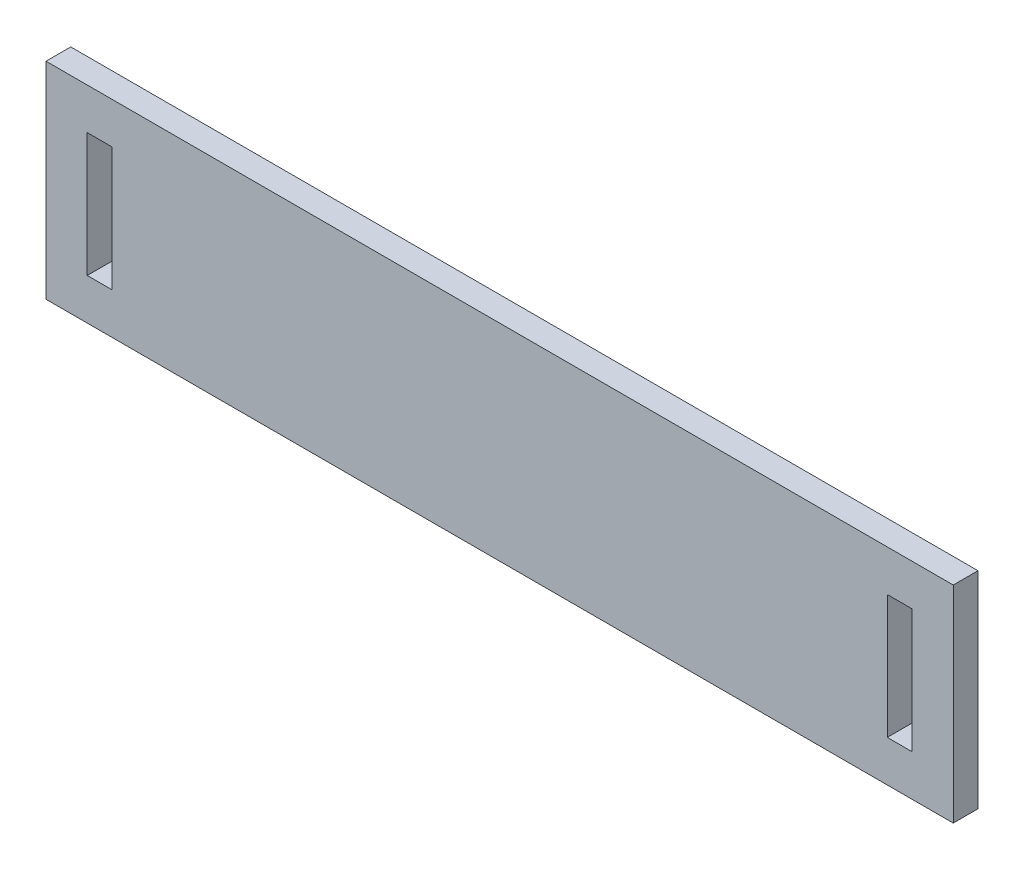
ISO-10303-21;
HEADER;
FILE_DESCRIPTION(('STEP AP214'),'2;1');
FILE_NAME('part.step','',(''),(''),'','','');
FILE_SCHEMA(('AUTOMOTIVE_DESIGN { 1 0 10303 214 1 1 1 1 }'));
ENDSEC;
DATA;
#1=APPLICATION_CONTEXT('core data for automotive mechanical design processes');
#2=APPLICATION_PROTOCOL_DEFINITION('international standard','automotive_design',2000,#1);
#3=PRODUCT_CONTEXT('',#1,'mechanical');
#4=PRODUCT('Part','Part','',(#3));
#5=PRODUCT_RELATED_PRODUCT_CATEGORY('part','',(#4));
#6=PRODUCT_DEFINITION_FORMATION('','',#4);
#7=PRODUCT_DEFINITION_CONTEXT('part definition',#1,'design');
#8=PRODUCT_DEFINITION('design','',#6,#7);
#9=PRODUCT_DEFINITION_SHAPE('','',#8);
#10=(LENGTH_UNIT() NAMED_UNIT(*) SI_UNIT(.MILLI.,.METRE.));
#11=(NAMED_UNIT(*) PLANE_ANGLE_UNIT() SI_UNIT($,.RADIAN.));
#12=(NAMED_UNIT(*) SI_UNIT($,.STERADIAN.) SOLID_ANGLE_UNIT());
#13=UNCERTAINTY_MEASURE_WITH_UNIT(LENGTH_MEASURE(1.E-05),#10,'distance_accuracy_value','');
#14=(GEOMETRIC_REPRESENTATION_CONTEXT(3) GLOBAL_UNCERTAINTY_ASSIGNED_CONTEXT((#13)) GLOBAL_UNIT_ASSIGNED_CONTEXT((#10,
#11,#12)) REPRESENTATION_CONTEXT('',''));
#15=CARTESIAN_POINT('',(0.,0.,0.));
#16=DIRECTION('',(0.,0.,1.));
#17=DIRECTION('',(1.,0.,0.));
#18=AXIS2_PLACEMENT_3D('',#15,#16,#17);
#19=CARTESIAN_POINT('',(55.,12.5,3.));
#20=DIRECTION('',(-1.,0.,0.));
#21=DIRECTION('',(0.,-1.,0.));
#22=AXIS2_PLACEMENT_3D('',#19,#20,#21);
#23=PLANE('',#22);
#24=DIRECTION('',(0.,1.,0.));
#25=VECTOR('',#24,1.);
#26=CARTESIAN_POINT('',(55.,12.5,0.));
#27=LINE('',#26,#25);
#28=CARTESIAN_POINT('',(55.,-12.5,0.));
#29=VERTEX_POINT('',#28);
#30=CARTESIAN_POINT('',(55.,12.5,0.));
#31=VERTEX_POINT('',#30);
#32=EDGE_CURVE('E161',#29,#31,#27,.T.);
#33=ORIENTED_EDGE('',*,*,#32,.T.);
#34=DIRECTION('',(0.,0.,-1.));
#35=VECTOR('',#34,1.);
#36=CARTESIAN_POINT('',(55.,12.5,3.));
#37=LINE('',#36,#35);
#38=CARTESIAN_POINT('',(55.,12.5,3.));
#39=VERTEX_POINT('',#38);
#40=EDGE_CURVE('E11',#39,#31,#37,.T.);
#41=ORIENTED_EDGE('',*,*,#40,.F.);
#42=DIRECTION('',(0.,1.,0.));
#43=VECTOR('',#42,1.);
#44=CARTESIAN_POINT('',(55.,12.5,3.));
#45=LINE('',#44,#43);
#46=CARTESIAN_POINT('',(55.,-12.5,3.));
#47=VERTEX_POINT('',#46);
#48=EDGE_CURVE('E194',#47,#39,#45,.T.);
#49=ORIENTED_EDGE('',*,*,#48,.F.);
#50=DIRECTION('',(0.,0.,-1.));
#51=VECTOR('',#50,1.);
#52=CARTESIAN_POINT('',(55.,-12.5,3.));
#53=LINE('',#52,#51);
#54=EDGE_CURVE('E204',#47,#29,#53,.T.);
#55=ORIENTED_EDGE('',*,*,#54,.T.);
#56=EDGE_LOOP('',(#33,#41,#49,#55));
#57=FACE_BOUND('',#56,.T.);
#58=ADVANCED_FACE('F35',(#57),#23,.F.);
#59=CARTESIAN_POINT('',(-55.,12.5,3.));
#60=DIRECTION('',(0.,-1.,0.));
#61=DIRECTION('',(0.,0.,-1.));
#62=AXIS2_PLACEMENT_3D('',#59,#60,#61);
#63=PLANE('',#62);
#64=DIRECTION('',(-1.,0.,0.));
#65=VECTOR('',#64,1.);
#66=CARTESIAN_POINT('',(-55.,12.5,0.));
#67=LINE('',#66,#65);
#68=CARTESIAN_POINT('',(-55.,12.5,0.));
#69=VERTEX_POINT('',#68);
#70=EDGE_CURVE('E207',#31,#69,#67,.T.);
#71=ORIENTED_EDGE('',*,*,#70,.T.);
#72=DIRECTION('',(0.,0.,-1.));
#73=VECTOR('',#72,1.);
#74=CARTESIAN_POINT('',(-55.,12.5,3.));
#75=LINE('',#74,#73);
#76=CARTESIAN_POINT('',(-55.,12.5,3.));
#77=VERTEX_POINT('',#76);
#78=EDGE_CURVE('E42',#77,#69,#75,.T.);
#79=ORIENTED_EDGE('',*,*,#78,.F.);
#80=DIRECTION('',(-1.,0.,0.));
#81=VECTOR('',#80,1.);
#82=CARTESIAN_POINT('',(-55.,12.5,3.));
#83=LINE('',#82,#81);
#84=EDGE_CURVE('E197',#39,#77,#83,.T.);
#85=ORIENTED_EDGE('',*,*,#84,.F.);
#86=ORIENTED_EDGE('',*,*,#40,.T.);
#87=EDGE_LOOP('',(#71,#79,#85,#86));
#88=FACE_BOUND('',#87,.T.);
#89=ADVANCED_FACE('F236',(#88),#63,.F.);
#90=CARTESIAN_POINT('',(-55.,12.5,3.));
#91=DIRECTION('',(1.,0.,0.));
#92=DIRECTION('',(0.,1.,0.));
#93=AXIS2_PLACEMENT_3D('',#90,#91,#92);
#94=PLANE('',#93);
#95=DIRECTION('',(0.,-1.,0.));
#96=VECTOR('',#95,1.);
#97=CARTESIAN_POINT('',(-55.,12.5,0.));
#98=LINE('',#97,#96);
#99=CARTESIAN_POINT('',(-55.,-12.5,0.));
#100=VERTEX_POINT('',#99);
#101=EDGE_CURVE('E209',#69,#100,#98,.T.);
#102=ORIENTED_EDGE('',*,*,#101,.T.);
#103=DIRECTION('',(0.,0.,-1.));
#104=VECTOR('',#103,1.);
#105=CARTESIAN_POINT('',(-55.,-12.5,3.));
#106=LINE('',#105,#104);
#107=CARTESIAN_POINT('',(-55.,-12.5,3.));
#108=VERTEX_POINT('',#107);
#109=EDGE_CURVE('E214',#108,#100,#106,.T.);
#110=ORIENTED_EDGE('',*,*,#109,.F.);
#111=DIRECTION('',(0.,-1.,0.));
#112=VECTOR('',#111,1.);
#113=CARTESIAN_POINT('',(-55.,12.5,3.));
#114=LINE('',#113,#112);
#115=EDGE_CURVE('E200',#77,#108,#114,.T.);
#116=ORIENTED_EDGE('',*,*,#115,.F.);
#117=ORIENTED_EDGE('',*,*,#78,.T.);
#118=EDGE_LOOP('',(#102,#110,#116,#117));
#119=FACE_BOUND('',#118,.T.);
#120=ADVANCED_FACE('F221',(#119),#94,.F.);
#121=CARTESIAN_POINT('',(-55.,-12.5,3.));
#122=DIRECTION('',(0.,1.,0.));
#123=DIRECTION('',(0.,0.,1.));
#124=AXIS2_PLACEMENT_3D('',#121,#122,#123);
#125=PLANE('',#124);
#126=DIRECTION('',(1.,0.,0.));
#127=VECTOR('',#126,1.);
#128=CARTESIAN_POINT('',(-55.,-12.5,0.));
#129=LINE('',#128,#127);
#130=EDGE_CURVE('E198',#100,#29,#129,.T.);
#131=ORIENTED_EDGE('',*,*,#130,.T.);
#132=ORIENTED_EDGE('',*,*,#54,.F.);
#133=DIRECTION('',(1.,0.,0.));
#134=VECTOR('',#133,1.);
#135=CARTESIAN_POINT('',(-55.,-12.5,3.));
#136=LINE('',#135,#134);
#137=EDGE_CURVE('E202',#108,#47,#136,.T.);
#138=ORIENTED_EDGE('',*,*,#137,.F.);
#139=ORIENTED_EDGE('',*,*,#109,.T.);
#140=EDGE_LOOP('',(#131,#132,#138,#139));
#141=FACE_BOUND('',#140,.T.);
#142=ADVANCED_FACE('F230',(#141),#125,.F.);
#143=CARTESIAN_POINT('',(0.,0.,3.));
#144=DIRECTION('',(0.,0.,1.));
#145=DIRECTION('',(1.,0.,0.));
#146=AXIS2_PLACEMENT_3D('',#143,#144,#145);
#147=PLANE('',#146);
#148=DIRECTION('',(0.,1.,0.));
#149=VECTOR('',#148,1.);
#150=CARTESIAN_POINT('',(47.,7.5,3.));
#151=LINE('',#150,#149);
#152=CARTESIAN_POINT('',(47.,-7.5,3.));
#153=VERTEX_POINT('',#152);
#154=CARTESIAN_POINT('',(47.,7.5,3.));
#155=VERTEX_POINT('',#154);
#156=EDGE_CURVE('E127',#153,#155,#151,.T.);
#157=ORIENTED_EDGE('',*,*,#156,.T.);
#158=DIRECTION('',(1.,0.,0.));
#159=VECTOR('',#158,1.);
#160=CARTESIAN_POINT('',(50.,7.5,3.));
#161=LINE('',#160,#159);
#162=CARTESIAN_POINT('',(50.,7.5,3.));
#163=VERTEX_POINT('',#162);
#164=EDGE_CURVE('E138',#155,#163,#161,.T.);
#165=ORIENTED_EDGE('',*,*,#164,.T.);
#166=DIRECTION('',(0.,-1.,0.));
#167=VECTOR('',#166,1.);
#168=CARTESIAN_POINT('',(50.,7.5,3.));
#169=LINE('',#168,#167);
#170=CARTESIAN_POINT('',(50.,-7.5,3.));
#171=VERTEX_POINT('',#170);
#172=EDGE_CURVE('E49',#163,#171,#169,.T.);
#173=ORIENTED_EDGE('',*,*,#172,.T.);
#174=DIRECTION('',(-1.,0.,0.));
#175=VECTOR('',#174,1.);
#176=CARTESIAN_POINT('',(50.,-7.5,3.));
#177=LINE('',#176,#175);
#178=EDGE_CURVE('E135',#171,#153,#177,.T.);
#179=ORIENTED_EDGE('',*,*,#178,.T.);
#180=EDGE_LOOP('',(#157,#165,#173,#179));
#181=FACE_BOUND('',#180,.T.);
#182=DIRECTION('',(0.,1.,0.));
#183=VECTOR('',#182,1.);
#184=CARTESIAN_POINT('',(-50.,7.50000000000001,3.));
#185=LINE('',#184,#183);
#186=CARTESIAN_POINT('',(-50.,-7.49999999999999,3.));
#187=VERTEX_POINT('',#186);
#188=CARTESIAN_POINT('',(-50.,7.50000000000001,3.));
#189=VERTEX_POINT('',#188);
#190=EDGE_CURVE('E165',#187,#189,#185,.T.);
#191=ORIENTED_EDGE('',*,*,#190,.T.);
#192=DIRECTION('',(1.,0.,0.));
#193=VECTOR('',#192,1.);
#194=CARTESIAN_POINT('',(-50.,7.50000000000001,3.));
#195=LINE('',#194,#193);
#196=CARTESIAN_POINT('',(-47.,7.50000000000001,3.));
#197=VERTEX_POINT('',#196);
#198=EDGE_CURVE('E168',#189,#197,#195,.T.);
#199=ORIENTED_EDGE('',*,*,#198,.T.);
#200=DIRECTION('',(0.,-1.,0.));
#201=VECTOR('',#200,1.);
#202=CARTESIAN_POINT('',(-47.,7.50000000000001,3.));
#203=LINE('',#202,#201);
#204=CARTESIAN_POINT('',(-47.,-7.49999999999999,3.));
#205=VERTEX_POINT('',#204);
#206=EDGE_CURVE('E57',#197,#205,#203,.T.);
#207=ORIENTED_EDGE('',*,*,#206,.T.);
#208=DIRECTION('',(-1.,0.,0.));
#209=VECTOR('',#208,1.);
#210=CARTESIAN_POINT('',(-50.,-7.49999999999999,3.));
#211=LINE('',#210,#209);
#212=EDGE_CURVE('E173',#205,#187,#211,.T.);
#213=ORIENTED_EDGE('',*,*,#212,.T.);
#214=EDGE_LOOP('',(#191,#199,#207,#213));
#215=FACE_BOUND('',#214,.T.);
#216=ORIENTED_EDGE('',*,*,#48,.T.);
#217=ORIENTED_EDGE('',*,*,#84,.T.);
#218=ORIENTED_EDGE('',*,*,#115,.T.);
#219=ORIENTED_EDGE('',*,*,#137,.T.);
#220=EDGE_LOOP('',(#216,#217,#218,#219));
#221=FACE_BOUND('',#220,.T.);
#222=ADVANCED_FACE('F142',(#181,#215,#221),#147,.T.);
#223=CARTESIAN_POINT('',(0.,0.,0.));
#224=DIRECTION('',(0.,0.,1.));
#225=DIRECTION('',(1.,0.,0.));
#226=AXIS2_PLACEMENT_3D('',#223,#224,#225);
#227=PLANE('',#226);
#228=DIRECTION('',(1.,0.,0.));
#229=VECTOR('',#228,1.);
#230=CARTESIAN_POINT('',(50.,7.5,0.));
#231=LINE('',#230,#229);
#232=CARTESIAN_POINT('',(47.,7.5,0.));
#233=VERTEX_POINT('',#232);
#234=CARTESIAN_POINT('',(50.,7.5,0.));
#235=VERTEX_POINT('',#234);
#236=EDGE_CURVE('E154',#233,#235,#231,.T.);
#237=ORIENTED_EDGE('',*,*,#236,.F.);
#238=DIRECTION('',(0.,1.,0.));
#239=VECTOR('',#238,1.);
#240=CARTESIAN_POINT('',(47.,7.5,0.));
#241=LINE('',#240,#239);
#242=CARTESIAN_POINT('',(47.,-7.5,0.));
#243=VERTEX_POINT('',#242);
#244=EDGE_CURVE('E130',#243,#233,#241,.T.);
#245=ORIENTED_EDGE('',*,*,#244,.F.);
#246=DIRECTION('',(-1.,0.,0.));
#247=VECTOR('',#246,1.);
#248=CARTESIAN_POINT('',(50.,-7.5,0.));
#249=LINE('',#248,#247);
#250=CARTESIAN_POINT('',(50.,-7.5,0.));
#251=VERTEX_POINT('',#250);
#252=EDGE_CURVE('E145',#251,#243,#249,.T.);
#253=ORIENTED_EDGE('',*,*,#252,.F.);
#254=DIRECTION('',(0.,-1.,0.));
#255=VECTOR('',#254,1.);
#256=CARTESIAN_POINT('',(50.,7.5,0.));
#257=LINE('',#256,#255);
#258=EDGE_CURVE('E148',#235,#251,#257,.T.);
#259=ORIENTED_EDGE('',*,*,#258,.F.);
#260=EDGE_LOOP('',(#237,#245,#253,#259));
#261=FACE_BOUND('',#260,.T.);
#262=DIRECTION('',(1.,0.,0.));
#263=VECTOR('',#262,1.);
#264=CARTESIAN_POINT('',(-50.,7.50000000000001,0.));
#265=LINE('',#264,#263);
#266=CARTESIAN_POINT('',(-50.,7.50000000000001,0.));
#267=VERTEX_POINT('',#266);
#268=CARTESIAN_POINT('',(-47.,7.50000000000001,0.));
#269=VERTEX_POINT('',#268);
#270=EDGE_CURVE('E179',#267,#269,#265,.T.);
#271=ORIENTED_EDGE('',*,*,#270,.F.);
#272=DIRECTION('',(0.,1.,0.));
#273=VECTOR('',#272,1.);
#274=CARTESIAN_POINT('',(-50.,7.50000000000001,0.));
#275=LINE('',#274,#273);
#276=CARTESIAN_POINT('',(-50.,-7.49999999999999,0.));
#277=VERTEX_POINT('',#276);
#278=EDGE_CURVE('E177',#277,#267,#275,.T.);
#279=ORIENTED_EDGE('',*,*,#278,.F.);
#280=DIRECTION('',(-1.,0.,0.));
#281=VECTOR('',#280,1.);
#282=CARTESIAN_POINT('',(-50.,-7.49999999999999,0.));
#283=LINE('',#282,#281);
#284=CARTESIAN_POINT('',(-47.,-7.49999999999999,0.));
#285=VERTEX_POINT('',#284);
#286=EDGE_CURVE('E169',#285,#277,#283,.T.);
#287=ORIENTED_EDGE('',*,*,#286,.F.);
#288=DIRECTION('',(0.,-1.,0.));
#289=VECTOR('',#288,1.);
#290=CARTESIAN_POINT('',(-47.,7.50000000000001,0.));
#291=LINE('',#290,#289);
#292=EDGE_CURVE('E182',#269,#285,#291,.T.);
#293=ORIENTED_EDGE('',*,*,#292,.F.);
#294=EDGE_LOOP('',(#271,#279,#287,#293));
#295=FACE_BOUND('',#294,.T.);
#296=ORIENTED_EDGE('',*,*,#32,.F.);
#297=ORIENTED_EDGE('',*,*,#130,.F.);
#298=ORIENTED_EDGE('',*,*,#101,.F.);
#299=ORIENTED_EDGE('',*,*,#70,.F.);
#300=EDGE_LOOP('',(#296,#297,#298,#299));
#301=FACE_BOUND('',#300,.T.);
#302=ADVANCED_FACE('F227',(#261,#295,#301),#227,.F.);
#303=CARTESIAN_POINT('',(-50.,7.50000000000001,3.));
#304=DIRECTION('',(-1.,0.,0.));
#305=DIRECTION('',(0.,-1.,0.));
#306=AXIS2_PLACEMENT_3D('',#303,#304,#305);
#307=PLANE('',#306);
#308=ORIENTED_EDGE('',*,*,#278,.T.);
#309=DIRECTION('',(0.,0.,-1.));
#310=VECTOR('',#309,1.);
#311=CARTESIAN_POINT('',(-50.,7.50000000000001,3.));
#312=LINE('',#311,#310);
#313=EDGE_CURVE('E176',#189,#267,#312,.T.);
#314=ORIENTED_EDGE('',*,*,#313,.F.);
#315=ORIENTED_EDGE('',*,*,#190,.F.);
#316=DIRECTION('',(0.,0.,-1.));
#317=VECTOR('',#316,1.);
#318=CARTESIAN_POINT('',(-50.,-7.49999999999999,3.));
#319=LINE('',#318,#317);
#320=EDGE_CURVE('E155',#187,#277,#319,.T.);
#321=ORIENTED_EDGE('',*,*,#320,.T.);
#322=EDGE_LOOP('',(#308,#314,#315,#321));
#323=FACE_BOUND('',#322,.T.);
#324=ADVANCED_FACE('F248',(#323),#307,.F.);
#325=CARTESIAN_POINT('',(-50.,-7.49999999999999,3.));
#326=DIRECTION('',(0.,-1.,0.));
#327=DIRECTION('',(1.,0.,0.));
#328=AXIS2_PLACEMENT_3D('',#325,#326,#327);
#329=PLANE('',#328);
#330=ORIENTED_EDGE('',*,*,#286,.T.);
#331=ORIENTED_EDGE('',*,*,#320,.F.);
#332=ORIENTED_EDGE('',*,*,#212,.F.);
#333=DIRECTION('',(0.,0.,-1.));
#334=VECTOR('',#333,1.);
#335=CARTESIAN_POINT('',(-47.,-7.49999999999999,3.));
#336=LINE('',#335,#334);
#337=EDGE_CURVE('E188',#205,#285,#336,.T.);
#338=ORIENTED_EDGE('',*,*,#337,.T.);
#339=EDGE_LOOP('',(#330,#331,#332,#338));
#340=FACE_BOUND('',#339,.T.);
#341=ADVANCED_FACE('F254',(#340),#329,.F.);
#342=CARTESIAN_POINT('',(-47.,7.50000000000001,3.));
#343=DIRECTION('',(1.,0.,0.));
#344=DIRECTION('',(0.,1.,0.));
#345=AXIS2_PLACEMENT_3D('',#342,#343,#344);
#346=PLANE('',#345);
#347=ORIENTED_EDGE('',*,*,#292,.T.);
#348=ORIENTED_EDGE('',*,*,#337,.F.);
#349=ORIENTED_EDGE('',*,*,#206,.F.);
#350=DIRECTION('',(0.,0.,-1.));
#351=VECTOR('',#350,1.);
#352=CARTESIAN_POINT('',(-47.,7.50000000000001,3.));
#353=LINE('',#352,#351);
#354=EDGE_CURVE('E190',#197,#269,#353,.T.);
#355=ORIENTED_EDGE('',*,*,#354,.T.);
#356=EDGE_LOOP('',(#347,#348,#349,#355));
#357=FACE_BOUND('',#356,.T.);
#358=ADVANCED_FACE('F259',(#357),#346,.F.);
#359=CARTESIAN_POINT('',(-50.,7.50000000000001,3.));
#360=DIRECTION('',(0.,1.,0.));
#361=DIRECTION('',(-1.,0.,0.));
#362=AXIS2_PLACEMENT_3D('',#359,#360,#361);
#363=PLANE('',#362);
#364=ORIENTED_EDGE('',*,*,#270,.T.);
#365=ORIENTED_EDGE('',*,*,#354,.F.);
#366=ORIENTED_EDGE('',*,*,#198,.F.);
#367=ORIENTED_EDGE('',*,*,#313,.T.);
#368=EDGE_LOOP('',(#364,#365,#366,#367));
#369=FACE_BOUND('',#368,.T.);
#370=ADVANCED_FACE('F256',(#369),#363,.F.);
#371=CARTESIAN_POINT('',(47.,7.5,3.));
#372=DIRECTION('',(-1.,0.,0.));
#373=DIRECTION('',(0.,-1.,0.));
#374=AXIS2_PLACEMENT_3D('',#371,#372,#373);
#375=PLANE('',#374);
#376=ORIENTED_EDGE('',*,*,#244,.T.);
#377=DIRECTION('',(0.,0.,-1.));
#378=VECTOR('',#377,1.);
#379=CARTESIAN_POINT('',(47.,7.5,3.));
#380=LINE('',#379,#378);
#381=EDGE_CURVE('E123',#155,#233,#380,.T.);
#382=ORIENTED_EDGE('',*,*,#381,.F.);
#383=ORIENTED_EDGE('',*,*,#156,.F.);
#384=DIRECTION('',(0.,0.,-1.));
#385=VECTOR('',#384,1.);
#386=CARTESIAN_POINT('',(47.,-7.5,3.));
#387=LINE('',#386,#385);
#388=EDGE_CURVE('E159',#153,#243,#387,.T.);
#389=ORIENTED_EDGE('',*,*,#388,.T.);
#390=EDGE_LOOP('',(#376,#382,#383,#389));
#391=FACE_BOUND('',#390,.T.);
#392=ADVANCED_FACE('F125',(#391),#375,.F.);
#393=CARTESIAN_POINT('',(50.,-7.5,3.));
#394=DIRECTION('',(0.,-1.,0.));
#395=DIRECTION('',(1.,0.,0.));
#396=AXIS2_PLACEMENT_3D('',#393,#394,#395);
#397=PLANE('',#396);
#398=ORIENTED_EDGE('',*,*,#252,.T.);
#399=ORIENTED_EDGE('',*,*,#388,.F.);
#400=ORIENTED_EDGE('',*,*,#178,.F.);
#401=DIRECTION('',(0.,0.,-1.));
#402=VECTOR('',#401,1.);
#403=CARTESIAN_POINT('',(50.,-7.5,3.));
#404=LINE('',#403,#402);
#405=EDGE_CURVE('E162',#171,#251,#404,.T.);
#406=ORIENTED_EDGE('',*,*,#405,.T.);
#407=EDGE_LOOP('',(#398,#399,#400,#406));
#408=FACE_BOUND('',#407,.T.);
#409=ADVANCED_FACE('F268',(#408),#397,.F.);
#410=CARTESIAN_POINT('',(50.,7.5,3.));
#411=DIRECTION('',(1.,0.,0.));
#412=DIRECTION('',(0.,0.,-1.));
#413=AXIS2_PLACEMENT_3D('',#410,#411,#412);
#414=PLANE('',#413);
#415=ORIENTED_EDGE('',*,*,#258,.T.);
#416=ORIENTED_EDGE('',*,*,#405,.F.);
#417=ORIENTED_EDGE('',*,*,#172,.F.);
#418=DIRECTION('',(0.,0.,-1.));
#419=VECTOR('',#418,1.);
#420=CARTESIAN_POINT('',(50.,7.5,3.));
#421=LINE('',#420,#419);
#422=EDGE_CURVE('E134',#163,#235,#421,.T.);
#423=ORIENTED_EDGE('',*,*,#422,.T.);
#424=EDGE_LOOP('',(#415,#416,#417,#423));
#425=FACE_BOUND('',#424,.T.);
#426=ADVANCED_FACE('F271',(#425),#414,.F.);
#427=CARTESIAN_POINT('',(50.,7.5,3.));
#428=DIRECTION('',(0.,1.,0.));
#429=DIRECTION('',(0.,0.,1.));
#430=AXIS2_PLACEMENT_3D('',#427,#428,#429);
#431=PLANE('',#430);
#432=ORIENTED_EDGE('',*,*,#236,.T.);
#433=ORIENTED_EDGE('',*,*,#422,.F.);
#434=ORIENTED_EDGE('',*,*,#164,.F.);
#435=ORIENTED_EDGE('',*,*,#381,.T.);
#436=EDGE_LOOP('',(#432,#433,#434,#435));
#437=FACE_BOUND('',#436,.T.);
#438=ADVANCED_FACE('F139',(#437),#431,.F.);
#439=CLOSED_SHELL('',(#58,#89,#120,#142,#222,#302,#324,#341,#358,#370,#392,#409,#426,#438));
#440=MANIFOLD_SOLID_BREP('B2',#439);
#441=ADVANCED_BREP_SHAPE_REPRESENTATION('',(#18,#440),#14);
#442=SHAPE_DEFINITION_REPRESENTATION(#9,#441);
ENDSEC;
END-ISO-10303-21;
